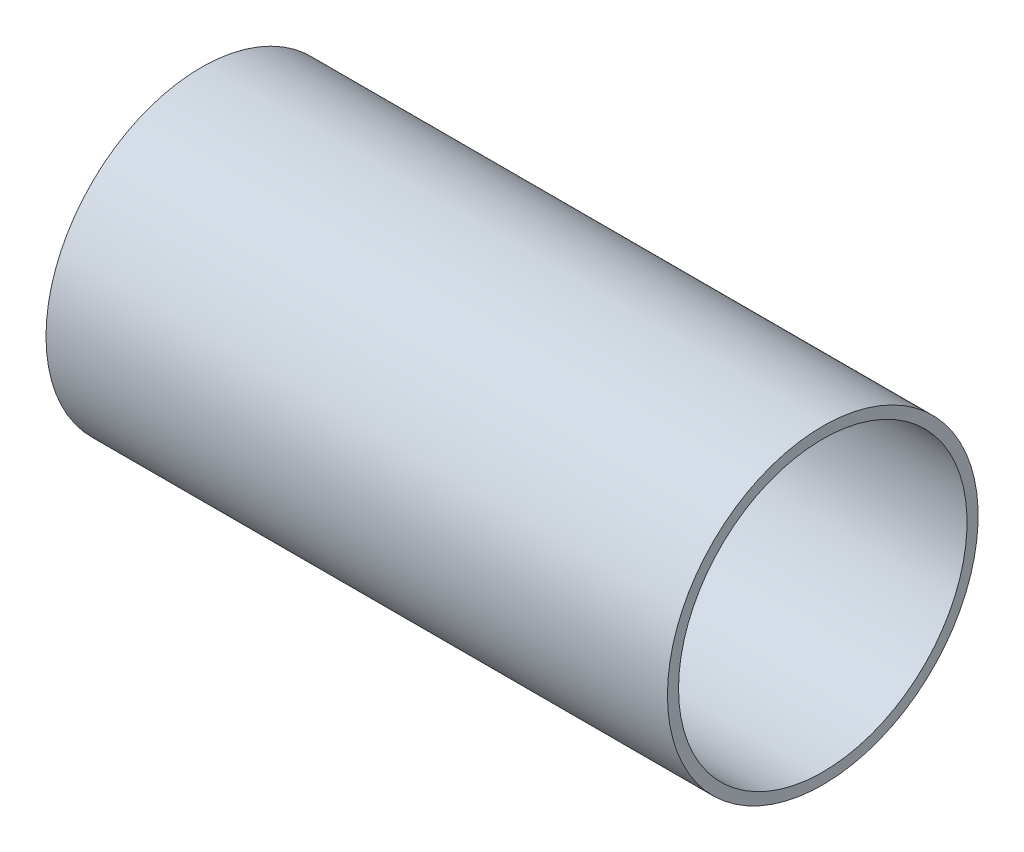
ISO-10303-21;
HEADER;
FILE_DESCRIPTION(('STEP AP214'),'2;1');
FILE_NAME('part.step','',(''),(''),'','','');
FILE_SCHEMA(('AUTOMOTIVE_DESIGN { 1 0 10303 214 1 1 1 1 }'));
ENDSEC;
DATA;
#1=APPLICATION_CONTEXT('core data for automotive mechanical design processes');
#2=APPLICATION_PROTOCOL_DEFINITION('international standard','automotive_design',2000,#1);
#3=PRODUCT_CONTEXT('',#1,'mechanical');
#4=PRODUCT('Part','Part','',(#3));
#5=PRODUCT_RELATED_PRODUCT_CATEGORY('part','',(#4));
#6=PRODUCT_DEFINITION_FORMATION('','',#4);
#7=PRODUCT_DEFINITION_CONTEXT('part definition',#1,'design');
#8=PRODUCT_DEFINITION('design','',#6,#7);
#9=PRODUCT_DEFINITION_SHAPE('','',#8);
#10=(LENGTH_UNIT() NAMED_UNIT(*) SI_UNIT(.MILLI.,.METRE.));
#11=(NAMED_UNIT(*) PLANE_ANGLE_UNIT() SI_UNIT($,.RADIAN.));
#12=(NAMED_UNIT(*) SI_UNIT($,.STERADIAN.) SOLID_ANGLE_UNIT());
#13=UNCERTAINTY_MEASURE_WITH_UNIT(LENGTH_MEASURE(1.E-05),#10,'distance_accuracy_value','');
#14=(GEOMETRIC_REPRESENTATION_CONTEXT(3) GLOBAL_UNCERTAINTY_ASSIGNED_CONTEXT((#13)) GLOBAL_UNIT_ASSIGNED_CONTEXT((#10,
#11,#12)) REPRESENTATION_CONTEXT('',''));
#15=CARTESIAN_POINT('',(0.,0.,0.));
#16=DIRECTION('',(0.,0.,1.));
#17=DIRECTION('',(1.,0.,0.));
#18=AXIS2_PLACEMENT_3D('',#15,#16,#17);
#19=CARTESIAN_POINT('',(-28.4361516034986,7.,0.));
#20=DIRECTION('',(1.,0.,0.));
#21=DIRECTION('',(0.,0.,-1.));
#22=AXIS2_PLACEMENT_3D('',#19,#20,#21);
#23=PLANE('',#22);
#24=CARTESIAN_POINT('',(-28.4361516034986,0.,0.));
#25=DIRECTION('',(-1.,0.,0.));
#26=DIRECTION('',(0.,0.,1.));
#27=AXIS2_PLACEMENT_3D('',#24,#25,#26);
#28=CIRCLE('',#27,6.5);
#29=CARTESIAN_POINT('',(-28.4361516034986,0.,6.5));
#30=VERTEX_POINT('',#29);
#31=EDGE_CURVE('E10',#30,#30,#28,.T.);
#32=ORIENTED_EDGE('',*,*,#31,.F.);
#33=EDGE_LOOP('',(#32));
#34=FACE_BOUND('',#33,.T.);
#35=CARTESIAN_POINT('',(-28.4361516034986,0.,0.));
#36=DIRECTION('',(-1.,0.,0.));
#37=DIRECTION('',(0.,0.,1.));
#38=AXIS2_PLACEMENT_3D('',#35,#36,#37);
#39=CIRCLE('',#38,7.);
#40=CARTESIAN_POINT('',(-28.4361516034986,0.,7.));
#41=VERTEX_POINT('',#40);
#42=EDGE_CURVE('E50',#41,#41,#39,.T.);
#43=ORIENTED_EDGE('',*,*,#42,.T.);
#44=EDGE_LOOP('',(#43));
#45=FACE_BOUND('',#44,.T.);
#46=ADVANCED_FACE('F36',(#34,#45),#23,.F.);
#47=CARTESIAN_POINT('',(-77.9361192095886,0.,0.));
#48=DIRECTION('',(-1.,0.,0.));
#49=DIRECTION('',(0.,0.,1.));
#50=AXIS2_PLACEMENT_3D('',#47,#48,#49);
#51=CYLINDRICAL_SURFACE('',#50,6.5);
#52=CARTESIAN_POINT('',(-0.436151603498552,0.,0.));
#53=DIRECTION('',(-1.,0.,0.));
#54=DIRECTION('',(0.,0.,1.));
#55=AXIS2_PLACEMENT_3D('',#52,#53,#54);
#56=CIRCLE('',#55,6.5);
#57=CARTESIAN_POINT('',(-0.436151603498552,0.,6.5));
#58=VERTEX_POINT('',#57);
#59=EDGE_CURVE('E42',#58,#58,#56,.T.);
#60=ORIENTED_EDGE('',*,*,#59,.F.);
#61=EDGE_LOOP('',(#60));
#62=FACE_BOUND('',#61,.T.);
#63=ORIENTED_EDGE('',*,*,#31,.T.);
#64=EDGE_LOOP('',(#63));
#65=FACE_BOUND('',#64,.T.);
#66=ADVANCED_FACE('F65',(#62,#65),#51,.F.);
#67=CARTESIAN_POINT('',(-0.436151603498549,6.5,0.));
#68=DIRECTION('',(-1.,0.,0.));
#69=DIRECTION('',(0.,0.,1.));
#70=AXIS2_PLACEMENT_3D('',#67,#68,#69);
#71=PLANE('',#70);
#72=CARTESIAN_POINT('',(-0.436151603498552,0.,0.));
#73=DIRECTION('',(-1.,0.,0.));
#74=DIRECTION('',(0.,0.,1.));
#75=AXIS2_PLACEMENT_3D('',#72,#73,#74);
#76=CIRCLE('',#75,7.);
#77=CARTESIAN_POINT('',(-0.436151603498552,0.,7.));
#78=VERTEX_POINT('',#77);
#79=EDGE_CURVE('E46',#78,#78,#76,.T.);
#80=ORIENTED_EDGE('',*,*,#79,.F.);
#81=EDGE_LOOP('',(#80));
#82=FACE_BOUND('',#81,.T.);
#83=ORIENTED_EDGE('',*,*,#59,.T.);
#84=EDGE_LOOP('',(#83));
#85=FACE_BOUND('',#84,.T.);
#86=ADVANCED_FACE('F60',(#82,#85),#71,.F.);
#87=CARTESIAN_POINT('',(-77.9361192095886,0.,0.));
#88=DIRECTION('',(-1.,0.,0.));
#89=DIRECTION('',(0.,0.,1.));
#90=AXIS2_PLACEMENT_3D('',#87,#88,#89);
#91=CYLINDRICAL_SURFACE('',#90,7.);
#92=ORIENTED_EDGE('',*,*,#42,.F.);
#93=EDGE_LOOP('',(#92));
#94=FACE_BOUND('',#93,.T.);
#95=ORIENTED_EDGE('',*,*,#79,.T.);
#96=EDGE_LOOP('',(#95));
#97=FACE_BOUND('',#96,.T.);
#98=ADVANCED_FACE('F57',(#94,#97),#91,.T.);
#99=CLOSED_SHELL('',(#46,#66,#86,#98));
#100=MANIFOLD_SOLID_BREP('B2',#99);
#101=ADVANCED_BREP_SHAPE_REPRESENTATION('',(#18,#100),#14);
#102=SHAPE_DEFINITION_REPRESENTATION(#9,#101);
ENDSEC;
END-ISO-10303-21;
